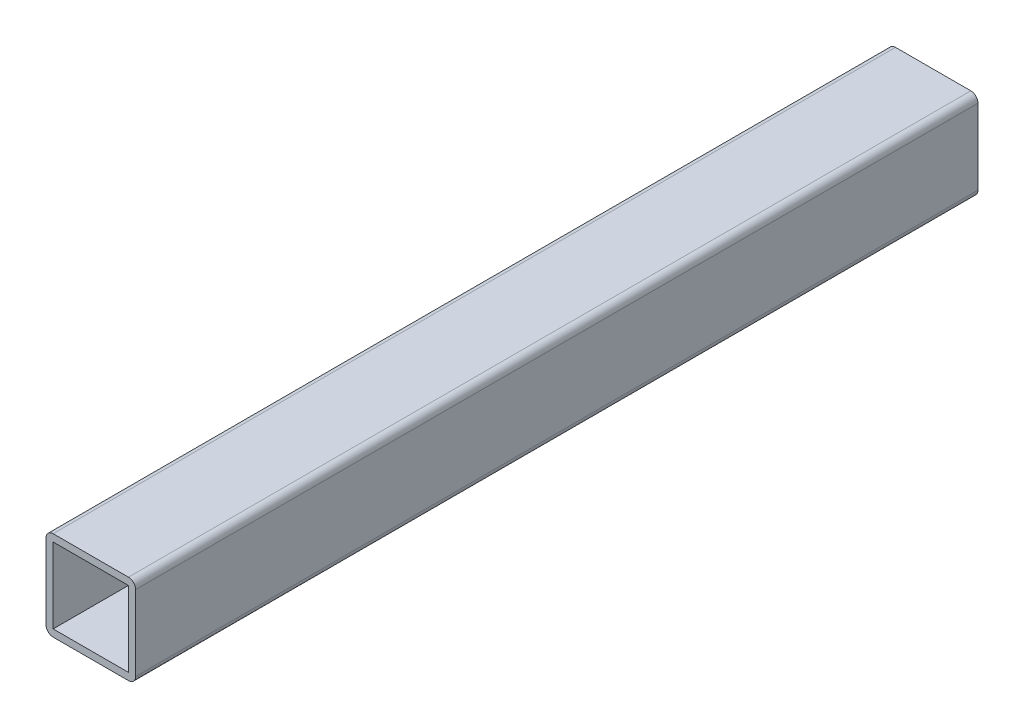
ISO-10303-21;
HEADER;
FILE_DESCRIPTION(('STEP AP214'),'2;1');
FILE_NAME('part.step','',(''),(''),'','','');
FILE_SCHEMA(('AUTOMOTIVE_DESIGN { 1 0 10303 214 1 1 1 1 }'));
ENDSEC;
DATA;
#1=APPLICATION_CONTEXT('core data for automotive mechanical design processes');
#2=APPLICATION_PROTOCOL_DEFINITION('international standard','automotive_design',2000,#1);
#3=PRODUCT_CONTEXT('',#1,'mechanical');
#4=PRODUCT('Part','Part','',(#3));
#5=PRODUCT_RELATED_PRODUCT_CATEGORY('part','',(#4));
#6=PRODUCT_DEFINITION_FORMATION('','',#4);
#7=PRODUCT_DEFINITION_CONTEXT('part definition',#1,'design');
#8=PRODUCT_DEFINITION('design','',#6,#7);
#9=PRODUCT_DEFINITION_SHAPE('','',#8);
#10=(LENGTH_UNIT() NAMED_UNIT(*) SI_UNIT(.MILLI.,.METRE.));
#11=(NAMED_UNIT(*) PLANE_ANGLE_UNIT() SI_UNIT($,.RADIAN.));
#12=(NAMED_UNIT(*) SI_UNIT($,.STERADIAN.) SOLID_ANGLE_UNIT());
#13=UNCERTAINTY_MEASURE_WITH_UNIT(LENGTH_MEASURE(1.E-05),#10,'distance_accuracy_value','');
#14=(GEOMETRIC_REPRESENTATION_CONTEXT(3) GLOBAL_UNCERTAINTY_ASSIGNED_CONTEXT((#13)) GLOBAL_UNIT_ASSIGNED_CONTEXT((#10,
#11,#12)) REPRESENTATION_CONTEXT('',''));
#15=CARTESIAN_POINT('',(0.,0.,0.));
#16=DIRECTION('',(0.,0.,1.));
#17=DIRECTION('',(1.,0.,0.));
#18=AXIS2_PLACEMENT_3D('',#15,#16,#17);
#19=CARTESIAN_POINT('',(4.,46.,470.));
#20=DIRECTION('',(0.,0.,-1.));
#21=DIRECTION('',(-1.,0.,0.));
#22=AXIS2_PLACEMENT_3D('',#19,#20,#21);
#23=PLANE('',#22);
#24=CARTESIAN_POINT('',(4.,46.,470.));
#25=DIRECTION('',(0.,0.,1.));
#26=DIRECTION('',(-1.,0.,0.));
#27=AXIS2_PLACEMENT_3D('',#24,#25,#26);
#28=CIRCLE('',#27,4.);
#29=CARTESIAN_POINT('',(4.,50.,470.));
#30=VERTEX_POINT('',#29);
#31=CARTESIAN_POINT('',(0.,46.,470.));
#32=VERTEX_POINT('',#31);
#33=EDGE_CURVE('E159',#30,#32,#28,.T.);
#34=ORIENTED_EDGE('',*,*,#33,.T.);
#35=DIRECTION('',(0.,-1.,0.));
#36=VECTOR('',#35,1.);
#37=CARTESIAN_POINT('',(0.,4.00000000000003,470.));
#38=LINE('',#37,#36);
#39=CARTESIAN_POINT('',(0.,4.00000000000003,470.));
#40=VERTEX_POINT('',#39);
#41=EDGE_CURVE('E162',#32,#40,#38,.T.);
#42=ORIENTED_EDGE('',*,*,#41,.T.);
#43=CARTESIAN_POINT('',(4.,4.,470.));
#44=DIRECTION('',(0.,0.,1.));
#45=DIRECTION('',(-1.,0.,0.));
#46=AXIS2_PLACEMENT_3D('',#43,#44,#45);
#47=CIRCLE('',#46,4.);
#48=CARTESIAN_POINT('',(4.00000000000003,0.,470.));
#49=VERTEX_POINT('',#48);
#50=EDGE_CURVE('E165',#40,#49,#47,.T.);
#51=ORIENTED_EDGE('',*,*,#50,.T.);
#52=DIRECTION('',(1.,0.,0.));
#53=VECTOR('',#52,1.);
#54=CARTESIAN_POINT('',(4.00000000000003,0.,470.));
#55=LINE('',#54,#53);
#56=CARTESIAN_POINT('',(46.,0.,470.));
#57=VERTEX_POINT('',#56);
#58=EDGE_CURVE('E167',#49,#57,#55,.T.);
#59=ORIENTED_EDGE('',*,*,#58,.T.);
#60=CARTESIAN_POINT('',(46.,4.,470.));
#61=DIRECTION('',(0.,0.,1.));
#62=DIRECTION('',(1.,0.,0.));
#63=AXIS2_PLACEMENT_3D('',#60,#61,#62);
#64=CIRCLE('',#63,4.);
#65=CARTESIAN_POINT('',(50.,4.,470.));
#66=VERTEX_POINT('',#65);
#67=EDGE_CURVE('E169',#57,#66,#64,.T.);
#68=ORIENTED_EDGE('',*,*,#67,.T.);
#69=DIRECTION('',(0.,1.,0.));
#70=VECTOR('',#69,1.);
#71=CARTESIAN_POINT('',(50.,4.,470.));
#72=LINE('',#71,#70);
#73=CARTESIAN_POINT('',(50.,46.,470.));
#74=VERTEX_POINT('',#73);
#75=EDGE_CURVE('E171',#66,#74,#72,.T.);
#76=ORIENTED_EDGE('',*,*,#75,.T.);
#77=CARTESIAN_POINT('',(46.,46.,470.));
#78=DIRECTION('',(0.,0.,1.));
#79=DIRECTION('',(1.,0.,0.));
#80=AXIS2_PLACEMENT_3D('',#77,#78,#79);
#81=CIRCLE('',#80,4.);
#82=CARTESIAN_POINT('',(46.,50.,470.));
#83=VERTEX_POINT('',#82);
#84=EDGE_CURVE('E173',#74,#83,#81,.T.);
#85=ORIENTED_EDGE('',*,*,#84,.T.);
#86=DIRECTION('',(-1.,0.,0.));
#87=VECTOR('',#86,1.);
#88=CARTESIAN_POINT('',(4.,50.,470.));
#89=LINE('',#88,#87);
#90=EDGE_CURVE('E175',#83,#30,#89,.T.);
#91=ORIENTED_EDGE('',*,*,#90,.T.);
#92=EDGE_LOOP('',(#34,#42,#51,#59,#68,#76,#85,#91));
#93=FACE_BOUND('',#92,.T.);
#94=DIRECTION('',(0.,-1.,0.));
#95=VECTOR('',#94,1.);
#96=CARTESIAN_POINT('',(4.,46.,470.));
#97=LINE('',#96,#95);
#98=CARTESIAN_POINT('',(4.,46.,470.));
#99=VERTEX_POINT('',#98);
#100=CARTESIAN_POINT('',(4.00000000000001,4.,470.));
#101=VERTEX_POINT('',#100);
#102=EDGE_CURVE('E123',#99,#101,#97,.T.);
#103=ORIENTED_EDGE('',*,*,#102,.F.);
#104=DIRECTION('',(-1.,0.,0.));
#105=VECTOR('',#104,1.);
#106=CARTESIAN_POINT('',(4.,46.,470.));
#107=LINE('',#106,#105);
#108=CARTESIAN_POINT('',(46.,46.,470.));
#109=VERTEX_POINT('',#108);
#110=EDGE_CURVE('E145',#109,#99,#107,.T.);
#111=ORIENTED_EDGE('',*,*,#110,.F.);
#112=DIRECTION('',(0.,1.,0.));
#113=VECTOR('',#112,1.);
#114=CARTESIAN_POINT('',(46.,46.,470.));
#115=LINE('',#114,#113);
#116=CARTESIAN_POINT('',(46.,4.,470.));
#117=VERTEX_POINT('',#116);
#118=EDGE_CURVE('E143',#117,#109,#115,.T.);
#119=ORIENTED_EDGE('',*,*,#118,.F.);
#120=DIRECTION('',(1.,0.,0.));
#121=VECTOR('',#120,1.);
#122=CARTESIAN_POINT('',(4.00000000000001,4.,470.));
#123=LINE('',#122,#121);
#124=EDGE_CURVE('E131',#101,#117,#123,.T.);
#125=ORIENTED_EDGE('',*,*,#124,.F.);
#126=EDGE_LOOP('',(#103,#111,#119,#125));
#127=FACE_BOUND('',#126,.T.);
#128=ADVANCED_FACE('F34',(#93,#127),#23,.F.);
#129=CARTESIAN_POINT('',(4.,46.,0.));
#130=DIRECTION('',(0.,0.,-1.));
#131=DIRECTION('',(-1.,0.,0.));
#132=AXIS2_PLACEMENT_3D('',#129,#130,#131);
#133=PLANE('',#132);
#134=CARTESIAN_POINT('',(4.,46.,0.));
#135=DIRECTION('',(0.,0.,1.));
#136=DIRECTION('',(-1.,0.,0.));
#137=AXIS2_PLACEMENT_3D('',#134,#135,#136);
#138=CIRCLE('',#137,4.);
#139=CARTESIAN_POINT('',(4.,50.,0.));
#140=VERTEX_POINT('',#139);
#141=CARTESIAN_POINT('',(0.,46.,0.));
#142=VERTEX_POINT('',#141);
#143=EDGE_CURVE('E139',#140,#142,#138,.T.);
#144=ORIENTED_EDGE('',*,*,#143,.F.);
#145=DIRECTION('',(-1.,0.,0.));
#146=VECTOR('',#145,1.);
#147=CARTESIAN_POINT('',(4.,50.,0.));
#148=LINE('',#147,#146);
#149=CARTESIAN_POINT('',(46.,50.,0.));
#150=VERTEX_POINT('',#149);
#151=EDGE_CURVE('E163',#150,#140,#148,.T.);
#152=ORIENTED_EDGE('',*,*,#151,.F.);
#153=CARTESIAN_POINT('',(46.,46.,0.));
#154=DIRECTION('',(0.,0.,1.));
#155=DIRECTION('',(1.,0.,0.));
#156=AXIS2_PLACEMENT_3D('',#153,#154,#155);
#157=CIRCLE('',#156,4.);
#158=CARTESIAN_POINT('',(50.,46.,0.));
#159=VERTEX_POINT('',#158);
#160=EDGE_CURVE('E190',#159,#150,#157,.T.);
#161=ORIENTED_EDGE('',*,*,#160,.F.);
#162=DIRECTION('',(0.,1.,0.));
#163=VECTOR('',#162,1.);
#164=CARTESIAN_POINT('',(50.,4.,0.));
#165=LINE('',#164,#163);
#166=CARTESIAN_POINT('',(50.,4.,0.));
#167=VERTEX_POINT('',#166);
#168=EDGE_CURVE('E188',#167,#159,#165,.T.);
#169=ORIENTED_EDGE('',*,*,#168,.F.);
#170=CARTESIAN_POINT('',(46.,4.,0.));
#171=DIRECTION('',(0.,0.,1.));
#172=DIRECTION('',(1.,0.,0.));
#173=AXIS2_PLACEMENT_3D('',#170,#171,#172);
#174=CIRCLE('',#173,4.);
#175=CARTESIAN_POINT('',(46.,0.,0.));
#176=VERTEX_POINT('',#175);
#177=EDGE_CURVE('E186',#176,#167,#174,.T.);
#178=ORIENTED_EDGE('',*,*,#177,.F.);
#179=DIRECTION('',(1.,0.,0.));
#180=VECTOR('',#179,1.);
#181=CARTESIAN_POINT('',(4.00000000000003,0.,0.));
#182=LINE('',#181,#180);
#183=CARTESIAN_POINT('',(4.00000000000003,0.,0.));
#184=VERTEX_POINT('',#183);
#185=EDGE_CURVE('E184',#184,#176,#182,.T.);
#186=ORIENTED_EDGE('',*,*,#185,.F.);
#187=CARTESIAN_POINT('',(4.,4.,0.));
#188=DIRECTION('',(0.,0.,1.));
#189=DIRECTION('',(-1.,0.,0.));
#190=AXIS2_PLACEMENT_3D('',#187,#188,#189);
#191=CIRCLE('',#190,4.);
#192=CARTESIAN_POINT('',(0.,4.00000000000003,0.));
#193=VERTEX_POINT('',#192);
#194=EDGE_CURVE('E182',#193,#184,#191,.T.);
#195=ORIENTED_EDGE('',*,*,#194,.F.);
#196=DIRECTION('',(0.,-1.,0.));
#197=VECTOR('',#196,1.);
#198=CARTESIAN_POINT('',(0.,4.00000000000003,0.));
#199=LINE('',#198,#197);
#200=EDGE_CURVE('E180',#142,#193,#199,.T.);
#201=ORIENTED_EDGE('',*,*,#200,.F.);
#202=EDGE_LOOP('',(#144,#152,#161,#169,#178,#186,#195,#201));
#203=FACE_BOUND('',#202,.T.);
#204=DIRECTION('',(-1.,0.,0.));
#205=VECTOR('',#204,1.);
#206=CARTESIAN_POINT('',(4.,46.,0.));
#207=LINE('',#206,#205);
#208=CARTESIAN_POINT('',(46.,46.,0.));
#209=VERTEX_POINT('',#208);
#210=CARTESIAN_POINT('',(4.,46.,0.));
#211=VERTEX_POINT('',#210);
#212=EDGE_CURVE('E132',#209,#211,#207,.T.);
#213=ORIENTED_EDGE('',*,*,#212,.T.);
#214=DIRECTION('',(0.,-1.,0.));
#215=VECTOR('',#214,1.);
#216=CARTESIAN_POINT('',(4.,46.,0.));
#217=LINE('',#216,#215);
#218=CARTESIAN_POINT('',(4.00000000000001,4.,0.));
#219=VERTEX_POINT('',#218);
#220=EDGE_CURVE('E57',#211,#219,#217,.T.);
#221=ORIENTED_EDGE('',*,*,#220,.T.);
#222=DIRECTION('',(1.,0.,0.));
#223=VECTOR('',#222,1.);
#224=CARTESIAN_POINT('',(4.00000000000001,4.,0.));
#225=LINE('',#224,#223);
#226=CARTESIAN_POINT('',(46.,4.,0.));
#227=VERTEX_POINT('',#226);
#228=EDGE_CURVE('E138',#219,#227,#225,.T.);
#229=ORIENTED_EDGE('',*,*,#228,.T.);
#230=DIRECTION('',(0.,1.,0.));
#231=VECTOR('',#230,1.);
#232=CARTESIAN_POINT('',(46.,46.,0.));
#233=LINE('',#232,#231);
#234=EDGE_CURVE('E151',#227,#209,#233,.T.);
#235=ORIENTED_EDGE('',*,*,#234,.T.);
#236=EDGE_LOOP('',(#213,#221,#229,#235));
#237=FACE_BOUND('',#236,.T.);
#238=ADVANCED_FACE('F220',(#203,#237),#133,.T.);
#239=CARTESIAN_POINT('',(4.,46.,470.));
#240=DIRECTION('',(0.,0.,-1.));
#241=DIRECTION('',(-1.,0.,0.));
#242=AXIS2_PLACEMENT_3D('',#239,#240,#241);
#243=CYLINDRICAL_SURFACE('',#242,4.);
#244=ORIENTED_EDGE('',*,*,#143,.T.);
#245=DIRECTION('',(0.,0.,-1.));
#246=VECTOR('',#245,1.);
#247=CARTESIAN_POINT('',(0.,46.,470.));
#248=LINE('',#247,#246);
#249=EDGE_CURVE('E11',#32,#142,#248,.T.);
#250=ORIENTED_EDGE('',*,*,#249,.F.);
#251=ORIENTED_EDGE('',*,*,#33,.F.);
#252=DIRECTION('',(0.,0.,-1.));
#253=VECTOR('',#252,1.);
#254=CARTESIAN_POINT('',(4.,50.,470.));
#255=LINE('',#254,#253);
#256=EDGE_CURVE('E177',#30,#140,#255,.T.);
#257=ORIENTED_EDGE('',*,*,#256,.T.);
#258=EDGE_LOOP('',(#244,#250,#251,#257));
#259=FACE_BOUND('',#258,.T.);
#260=ADVANCED_FACE('F36',(#259),#243,.T.);
#261=CARTESIAN_POINT('',(0.,4.00000000000003,470.));
#262=DIRECTION('',(1.,0.,0.));
#263=DIRECTION('',(0.,0.,-1.));
#264=AXIS2_PLACEMENT_3D('',#261,#262,#263);
#265=PLANE('',#264);
#266=ORIENTED_EDGE('',*,*,#200,.T.);
#267=DIRECTION('',(0.,0.,-1.));
#268=VECTOR('',#267,1.);
#269=CARTESIAN_POINT('',(0.,4.00000000000003,470.));
#270=LINE('',#269,#268);
#271=EDGE_CURVE('E42',#40,#193,#270,.T.);
#272=ORIENTED_EDGE('',*,*,#271,.F.);
#273=ORIENTED_EDGE('',*,*,#41,.F.);
#274=ORIENTED_EDGE('',*,*,#249,.T.);
#275=EDGE_LOOP('',(#266,#272,#273,#274));
#276=FACE_BOUND('',#275,.T.);
#277=ADVANCED_FACE('F237',(#276),#265,.F.);
#278=CARTESIAN_POINT('',(4.,4.,470.));
#279=DIRECTION('',(0.,0.,-1.));
#280=DIRECTION('',(-1.,0.,0.));
#281=AXIS2_PLACEMENT_3D('',#278,#279,#280);
#282=CYLINDRICAL_SURFACE('',#281,4.);
#283=ORIENTED_EDGE('',*,*,#194,.T.);
#284=DIRECTION('',(0.,0.,-1.));
#285=VECTOR('',#284,1.);
#286=CARTESIAN_POINT('',(4.00000000000003,0.,470.));
#287=LINE('',#286,#285);
#288=EDGE_CURVE('E207',#49,#184,#287,.T.);
#289=ORIENTED_EDGE('',*,*,#288,.F.);
#290=ORIENTED_EDGE('',*,*,#50,.F.);
#291=ORIENTED_EDGE('',*,*,#271,.T.);
#292=EDGE_LOOP('',(#283,#289,#290,#291));
#293=FACE_BOUND('',#292,.T.);
#294=ADVANCED_FACE('F214',(#293),#282,.T.);
#295=CARTESIAN_POINT('',(4.00000000000003,0.,470.));
#296=DIRECTION('',(0.,1.,0.));
#297=DIRECTION('',(0.,0.,1.));
#298=AXIS2_PLACEMENT_3D('',#295,#296,#297);
#299=PLANE('',#298);
#300=ORIENTED_EDGE('',*,*,#185,.T.);
#301=DIRECTION('',(0.,0.,-1.));
#302=VECTOR('',#301,1.);
#303=CARTESIAN_POINT('',(46.,0.,470.));
#304=LINE('',#303,#302);
#305=EDGE_CURVE('E204',#57,#176,#304,.T.);
#306=ORIENTED_EDGE('',*,*,#305,.F.);
#307=ORIENTED_EDGE('',*,*,#58,.F.);
#308=ORIENTED_EDGE('',*,*,#288,.T.);
#309=EDGE_LOOP('',(#300,#306,#307,#308));
#310=FACE_BOUND('',#309,.T.);
#311=ADVANCED_FACE('F226',(#310),#299,.F.);
#312=CARTESIAN_POINT('',(46.,4.,470.));
#313=DIRECTION('',(0.,0.,-1.));
#314=DIRECTION('',(-1.,0.,0.));
#315=AXIS2_PLACEMENT_3D('',#312,#313,#314);
#316=CYLINDRICAL_SURFACE('',#315,4.);
#317=ORIENTED_EDGE('',*,*,#177,.T.);
#318=DIRECTION('',(0.,0.,-1.));
#319=VECTOR('',#318,1.);
#320=CARTESIAN_POINT('',(50.,4.,470.));
#321=LINE('',#320,#319);
#322=EDGE_CURVE('E201',#66,#167,#321,.T.);
#323=ORIENTED_EDGE('',*,*,#322,.F.);
#324=ORIENTED_EDGE('',*,*,#67,.F.);
#325=ORIENTED_EDGE('',*,*,#305,.T.);
#326=EDGE_LOOP('',(#317,#323,#324,#325));
#327=FACE_BOUND('',#326,.T.);
#328=ADVANCED_FACE('F230',(#327),#316,.T.);
#329=CARTESIAN_POINT('',(50.,4.,470.));
#330=DIRECTION('',(-1.,0.,0.));
#331=DIRECTION('',(0.,0.,1.));
#332=AXIS2_PLACEMENT_3D('',#329,#330,#331);
#333=PLANE('',#332);
#334=ORIENTED_EDGE('',*,*,#168,.T.);
#335=DIRECTION('',(0.,0.,-1.));
#336=VECTOR('',#335,1.);
#337=CARTESIAN_POINT('',(50.,46.,470.));
#338=LINE('',#337,#336);
#339=EDGE_CURVE('E198',#74,#159,#338,.T.);
#340=ORIENTED_EDGE('',*,*,#339,.F.);
#341=ORIENTED_EDGE('',*,*,#75,.F.);
#342=ORIENTED_EDGE('',*,*,#322,.T.);
#343=EDGE_LOOP('',(#334,#340,#341,#342));
#344=FACE_BOUND('',#343,.T.);
#345=ADVANCED_FACE('F250',(#344),#333,.F.);
#346=CARTESIAN_POINT('',(46.,46.,470.));
#347=DIRECTION('',(0.,0.,-1.));
#348=DIRECTION('',(-1.,0.,0.));
#349=AXIS2_PLACEMENT_3D('',#346,#347,#348);
#350=CYLINDRICAL_SURFACE('',#349,4.);
#351=ORIENTED_EDGE('',*,*,#160,.T.);
#352=DIRECTION('',(0.,0.,-1.));
#353=VECTOR('',#352,1.);
#354=CARTESIAN_POINT('',(46.,50.,470.));
#355=LINE('',#354,#353);
#356=EDGE_CURVE('E195',#83,#150,#355,.T.);
#357=ORIENTED_EDGE('',*,*,#356,.F.);
#358=ORIENTED_EDGE('',*,*,#84,.F.);
#359=ORIENTED_EDGE('',*,*,#339,.T.);
#360=EDGE_LOOP('',(#351,#357,#358,#359));
#361=FACE_BOUND('',#360,.T.);
#362=ADVANCED_FACE('F248',(#361),#350,.T.);
#363=CARTESIAN_POINT('',(4.,50.,470.));
#364=DIRECTION('',(0.,-1.,0.));
#365=DIRECTION('',(0.,0.,-1.));
#366=AXIS2_PLACEMENT_3D('',#363,#364,#365);
#367=PLANE('',#366);
#368=ORIENTED_EDGE('',*,*,#151,.T.);
#369=ORIENTED_EDGE('',*,*,#256,.F.);
#370=ORIENTED_EDGE('',*,*,#90,.F.);
#371=ORIENTED_EDGE('',*,*,#356,.T.);
#372=EDGE_LOOP('',(#368,#369,#370,#371));
#373=FACE_BOUND('',#372,.T.);
#374=ADVANCED_FACE('F243',(#373),#367,.F.);
#375=CARTESIAN_POINT('',(4.,46.,470.));
#376=DIRECTION('',(1.,0.,0.));
#377=DIRECTION('',(0.,1.,0.));
#378=AXIS2_PLACEMENT_3D('',#375,#376,#377);
#379=PLANE('',#378);
#380=ORIENTED_EDGE('',*,*,#220,.F.);
#381=DIRECTION('',(0.,0.,-1.));
#382=VECTOR('',#381,1.);
#383=CARTESIAN_POINT('',(4.,46.,470.));
#384=LINE('',#383,#382);
#385=EDGE_CURVE('E127',#99,#211,#384,.T.);
#386=ORIENTED_EDGE('',*,*,#385,.F.);
#387=ORIENTED_EDGE('',*,*,#102,.T.);
#388=DIRECTION('',(0.,0.,-1.));
#389=VECTOR('',#388,1.);
#390=CARTESIAN_POINT('',(4.00000000000001,4.,470.));
#391=LINE('',#390,#389);
#392=EDGE_CURVE('E126',#101,#219,#391,.T.);
#393=ORIENTED_EDGE('',*,*,#392,.T.);
#394=EDGE_LOOP('',(#380,#386,#387,#393));
#395=FACE_BOUND('',#394,.T.);
#396=ADVANCED_FACE('F125',(#395),#379,.T.);
#397=CARTESIAN_POINT('',(4.00000000000001,4.,470.));
#398=DIRECTION('',(0.,1.,0.));
#399=DIRECTION('',(0.,0.,1.));
#400=AXIS2_PLACEMENT_3D('',#397,#398,#399);
#401=PLANE('',#400);
#402=ORIENTED_EDGE('',*,*,#228,.F.);
#403=ORIENTED_EDGE('',*,*,#392,.F.);
#404=ORIENTED_EDGE('',*,*,#124,.T.);
#405=DIRECTION('',(0.,0.,-1.));
#406=VECTOR('',#405,1.);
#407=CARTESIAN_POINT('',(46.,4.,470.));
#408=LINE('',#407,#406);
#409=EDGE_CURVE('E140',#117,#227,#408,.T.);
#410=ORIENTED_EDGE('',*,*,#409,.T.);
#411=EDGE_LOOP('',(#402,#403,#404,#410));
#412=FACE_BOUND('',#411,.T.);
#413=ADVANCED_FACE('F135',(#412),#401,.T.);
#414=CARTESIAN_POINT('',(46.,46.,470.));
#415=DIRECTION('',(-1.,0.,0.));
#416=DIRECTION('',(0.,-1.,0.));
#417=AXIS2_PLACEMENT_3D('',#414,#415,#416);
#418=PLANE('',#417);
#419=ORIENTED_EDGE('',*,*,#234,.F.);
#420=ORIENTED_EDGE('',*,*,#409,.F.);
#421=ORIENTED_EDGE('',*,*,#118,.T.);
#422=DIRECTION('',(0.,0.,-1.));
#423=VECTOR('',#422,1.);
#424=CARTESIAN_POINT('',(46.,46.,470.));
#425=LINE('',#424,#423);
#426=EDGE_CURVE('E49',#109,#209,#425,.T.);
#427=ORIENTED_EDGE('',*,*,#426,.T.);
#428=EDGE_LOOP('',(#419,#420,#421,#427));
#429=FACE_BOUND('',#428,.T.);
#430=ADVANCED_FACE('F275',(#429),#418,.T.);
#431=CARTESIAN_POINT('',(4.,46.,470.));
#432=DIRECTION('',(0.,-1.,0.));
#433=DIRECTION('',(0.,0.,-1.));
#434=AXIS2_PLACEMENT_3D('',#431,#432,#433);
#435=PLANE('',#434);
#436=ORIENTED_EDGE('',*,*,#212,.F.);
#437=ORIENTED_EDGE('',*,*,#426,.F.);
#438=ORIENTED_EDGE('',*,*,#110,.T.);
#439=ORIENTED_EDGE('',*,*,#385,.T.);
#440=EDGE_LOOP('',(#436,#437,#438,#439));
#441=FACE_BOUND('',#440,.T.);
#442=ADVANCED_FACE('F279',(#441),#435,.T.);
#443=CLOSED_SHELL('',(#128,#238,#260,#277,#294,#311,#328,#345,#362,#374,#396,#413,#430,#442));
#444=MANIFOLD_SOLID_BREP('B2',#443);
#445=ADVANCED_BREP_SHAPE_REPRESENTATION('',(#18,#444),#14);
#446=SHAPE_DEFINITION_REPRESENTATION(#9,#445);
ENDSEC;
END-ISO-10303-21;
